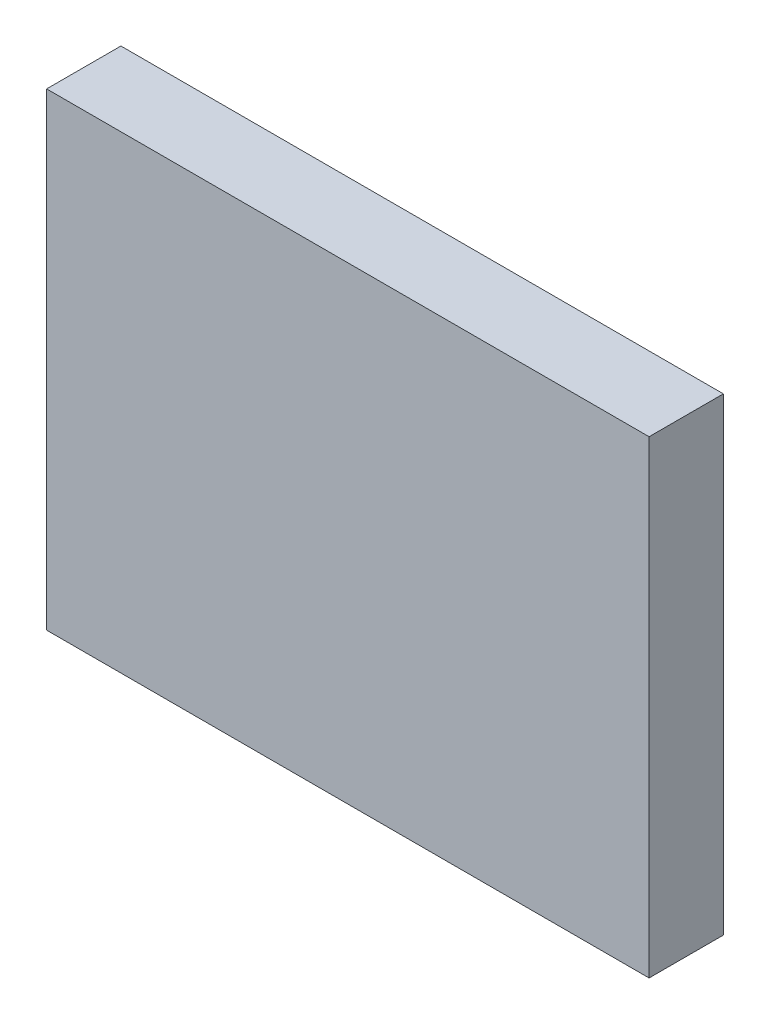
ISO-10303-21;
HEADER;
FILE_DESCRIPTION(('STEP AP214'),'2;1');
FILE_NAME('part.step','',(''),(''),'','','');
FILE_SCHEMA(('AUTOMOTIVE_DESIGN { 1 0 10303 214 1 1 1 1 }'));
ENDSEC;
DATA;
#1=APPLICATION_CONTEXT('core data for automotive mechanical design processes');
#2=APPLICATION_PROTOCOL_DEFINITION('international standard','automotive_design',2000,#1);
#3=PRODUCT_CONTEXT('',#1,'mechanical');
#4=PRODUCT('Part','Part','',(#3));
#5=PRODUCT_RELATED_PRODUCT_CATEGORY('part','',(#4));
#6=PRODUCT_DEFINITION_FORMATION('','',#4);
#7=PRODUCT_DEFINITION_CONTEXT('part definition',#1,'design');
#8=PRODUCT_DEFINITION('design','',#6,#7);
#9=PRODUCT_DEFINITION_SHAPE('','',#8);
#10=(LENGTH_UNIT() NAMED_UNIT(*) SI_UNIT(.MILLI.,.METRE.));
#11=(NAMED_UNIT(*) PLANE_ANGLE_UNIT() SI_UNIT($,.RADIAN.));
#12=(NAMED_UNIT(*) SI_UNIT($,.STERADIAN.) SOLID_ANGLE_UNIT());
#13=UNCERTAINTY_MEASURE_WITH_UNIT(LENGTH_MEASURE(1.E-05),#10,'distance_accuracy_value','');
#14=(GEOMETRIC_REPRESENTATION_CONTEXT(3) GLOBAL_UNCERTAINTY_ASSIGNED_CONTEXT((#13)) GLOBAL_UNIT_ASSIGNED_CONTEXT((#10,
#11,#12)) REPRESENTATION_CONTEXT('',''));
#15=CARTESIAN_POINT('',(0.,0.,0.));
#16=DIRECTION('',(0.,0.,1.));
#17=DIRECTION('',(1.,0.,0.));
#18=AXIS2_PLACEMENT_3D('',#15,#16,#17);
#19=CARTESIAN_POINT('',(-3.65,-2.8,0.9));
#20=DIRECTION('',(1.,0.,0.));
#21=DIRECTION('',(0.,0.,-1.));
#22=AXIS2_PLACEMENT_3D('',#19,#20,#21);
#23=PLANE('',#22);
#24=DIRECTION('',(0.,-1.,0.));
#25=VECTOR('',#24,1.);
#26=CARTESIAN_POINT('',(-3.65,-2.8,0.));
#27=LINE('',#26,#25);
#28=CARTESIAN_POINT('',(-3.65,2.88,0.));
#29=VERTEX_POINT('',#28);
#30=CARTESIAN_POINT('',(-3.65,-2.8,0.));
#31=VERTEX_POINT('',#30);
#32=EDGE_CURVE('E96',#29,#31,#27,.T.);
#33=ORIENTED_EDGE('',*,*,#32,.T.);
#34=DIRECTION('',(0.,0.,-1.));
#35=VECTOR('',#34,1.);
#36=CARTESIAN_POINT('',(-3.65,-2.8,0.9));
#37=LINE('',#36,#35);
#38=CARTESIAN_POINT('',(-3.65,-2.8,0.9));
#39=VERTEX_POINT('',#38);
#40=EDGE_CURVE('E11',#39,#31,#37,.T.);
#41=ORIENTED_EDGE('',*,*,#40,.F.);
#42=DIRECTION('',(0.,-1.,0.));
#43=VECTOR('',#42,1.);
#44=CARTESIAN_POINT('',(-3.65,-2.8,0.9));
#45=LINE('',#44,#43);
#46=CARTESIAN_POINT('',(-3.65,2.88,0.9));
#47=VERTEX_POINT('',#46);
#48=EDGE_CURVE('E84',#47,#39,#45,.T.);
#49=ORIENTED_EDGE('',*,*,#48,.F.);
#50=DIRECTION('',(0.,0.,-1.));
#51=VECTOR('',#50,1.);
#52=CARTESIAN_POINT('',(-3.65,2.88,0.9));
#53=LINE('',#52,#51);
#54=EDGE_CURVE('E92',#47,#29,#53,.T.);
#55=ORIENTED_EDGE('',*,*,#54,.T.);
#56=EDGE_LOOP('',(#33,#41,#49,#55));
#57=FACE_BOUND('',#56,.T.);
#58=ADVANCED_FACE('F33',(#57),#23,.F.);
#59=CARTESIAN_POINT('',(3.65,-2.8,0.9));
#60=DIRECTION('',(0.,1.,0.));
#61=DIRECTION('',(0.,0.,1.));
#62=AXIS2_PLACEMENT_3D('',#59,#60,#61);
#63=PLANE('',#62);
#64=DIRECTION('',(1.,0.,0.));
#65=VECTOR('',#64,1.);
#66=CARTESIAN_POINT('',(3.65,-2.8,0.));
#67=LINE('',#66,#65);
#68=CARTESIAN_POINT('',(3.65,-2.8,0.));
#69=VERTEX_POINT('',#68);
#70=EDGE_CURVE('E88',#31,#69,#67,.T.);
#71=ORIENTED_EDGE('',*,*,#70,.T.);
#72=DIRECTION('',(0.,0.,-1.));
#73=VECTOR('',#72,1.);
#74=CARTESIAN_POINT('',(3.65,-2.8,0.9));
#75=LINE('',#74,#73);
#76=CARTESIAN_POINT('',(3.65,-2.8,0.9));
#77=VERTEX_POINT('',#76);
#78=EDGE_CURVE('E41',#77,#69,#75,.T.);
#79=ORIENTED_EDGE('',*,*,#78,.F.);
#80=DIRECTION('',(1.,0.,0.));
#81=VECTOR('',#80,1.);
#82=CARTESIAN_POINT('',(3.65,-2.8,0.9));
#83=LINE('',#82,#81);
#84=EDGE_CURVE('E79',#39,#77,#83,.T.);
#85=ORIENTED_EDGE('',*,*,#84,.F.);
#86=ORIENTED_EDGE('',*,*,#40,.T.);
#87=EDGE_LOOP('',(#71,#79,#85,#86));
#88=FACE_BOUND('',#87,.T.);
#89=ADVANCED_FACE('F87',(#88),#63,.F.);
#90=CARTESIAN_POINT('',(3.65,2.88,0.9));
#91=DIRECTION('',(-1.,0.,0.));
#92=DIRECTION('',(0.,0.,1.));
#93=AXIS2_PLACEMENT_3D('',#90,#91,#92);
#94=PLANE('',#93);
#95=DIRECTION('',(0.,1.,0.));
#96=VECTOR('',#95,1.);
#97=CARTESIAN_POINT('',(3.65,2.88,0.));
#98=LINE('',#97,#96);
#99=CARTESIAN_POINT('',(3.65,2.88,0.));
#100=VERTEX_POINT('',#99);
#101=EDGE_CURVE('E66',#69,#100,#98,.T.);
#102=ORIENTED_EDGE('',*,*,#101,.T.);
#103=DIRECTION('',(0.,0.,-1.));
#104=VECTOR('',#103,1.);
#105=CARTESIAN_POINT('',(3.65,2.88,0.9));
#106=LINE('',#105,#104);
#107=CARTESIAN_POINT('',(3.65,2.88,0.9));
#108=VERTEX_POINT('',#107);
#109=EDGE_CURVE('E89',#108,#100,#106,.T.);
#110=ORIENTED_EDGE('',*,*,#109,.F.);
#111=DIRECTION('',(0.,1.,0.));
#112=VECTOR('',#111,1.);
#113=CARTESIAN_POINT('',(3.65,2.88,0.9));
#114=LINE('',#113,#112);
#115=EDGE_CURVE('E82',#77,#108,#114,.T.);
#116=ORIENTED_EDGE('',*,*,#115,.F.);
#117=ORIENTED_EDGE('',*,*,#78,.T.);
#118=EDGE_LOOP('',(#102,#110,#116,#117));
#119=FACE_BOUND('',#118,.T.);
#120=ADVANCED_FACE('F90',(#119),#94,.F.);
#121=CARTESIAN_POINT('',(-3.65,2.88,0.9));
#122=DIRECTION('',(0.,-1.,0.));
#123=DIRECTION('',(0.,0.,-1.));
#124=AXIS2_PLACEMENT_3D('',#121,#122,#123);
#125=PLANE('',#124);
#126=DIRECTION('',(-1.,0.,0.));
#127=VECTOR('',#126,1.);
#128=CARTESIAN_POINT('',(-3.65,2.88,0.));
#129=LINE('',#128,#127);
#130=EDGE_CURVE('E72',#100,#29,#129,.T.);
#131=ORIENTED_EDGE('',*,*,#130,.T.);
#132=ORIENTED_EDGE('',*,*,#54,.F.);
#133=DIRECTION('',(-1.,0.,0.));
#134=VECTOR('',#133,1.);
#135=CARTESIAN_POINT('',(-3.65,2.88,0.9));
#136=LINE('',#135,#134);
#137=EDGE_CURVE('E49',#108,#47,#136,.T.);
#138=ORIENTED_EDGE('',*,*,#137,.F.);
#139=ORIENTED_EDGE('',*,*,#109,.T.);
#140=EDGE_LOOP('',(#131,#132,#138,#139));
#141=FACE_BOUND('',#140,.T.);
#142=ADVANCED_FACE('F103',(#141),#125,.F.);
#143=CARTESIAN_POINT('',(0.,0.,0.9));
#144=DIRECTION('',(0.,0.,-1.));
#145=DIRECTION('',(-1.,0.,0.));
#146=AXIS2_PLACEMENT_3D('',#143,#144,#145);
#147=PLANE('',#146);
#148=ORIENTED_EDGE('',*,*,#48,.T.);
#149=ORIENTED_EDGE('',*,*,#84,.T.);
#150=ORIENTED_EDGE('',*,*,#115,.T.);
#151=ORIENTED_EDGE('',*,*,#137,.T.);
#152=EDGE_LOOP('',(#148,#149,#150,#151));
#153=FACE_BOUND('',#152,.T.);
#154=ADVANCED_FACE('F80',(#153),#147,.F.);
#155=CARTESIAN_POINT('',(0.,0.,0.));
#156=DIRECTION('',(0.,0.,-1.));
#157=DIRECTION('',(-1.,0.,0.));
#158=AXIS2_PLACEMENT_3D('',#155,#156,#157);
#159=PLANE('',#158);
#160=ORIENTED_EDGE('',*,*,#32,.F.);
#161=ORIENTED_EDGE('',*,*,#130,.F.);
#162=ORIENTED_EDGE('',*,*,#101,.F.);
#163=ORIENTED_EDGE('',*,*,#70,.F.);
#164=EDGE_LOOP('',(#160,#161,#162,#163));
#165=FACE_BOUND('',#164,.T.);
#166=ADVANCED_FACE('F106',(#165),#159,.T.);
#167=CLOSED_SHELL('',(#58,#89,#120,#142,#154,#166));
#168=MANIFOLD_SOLID_BREP('B2',#167);
#169=ADVANCED_BREP_SHAPE_REPRESENTATION('',(#18,#168),#14);
#170=SHAPE_DEFINITION_REPRESENTATION(#9,#169);
ENDSEC;
END-ISO-10303-21;
